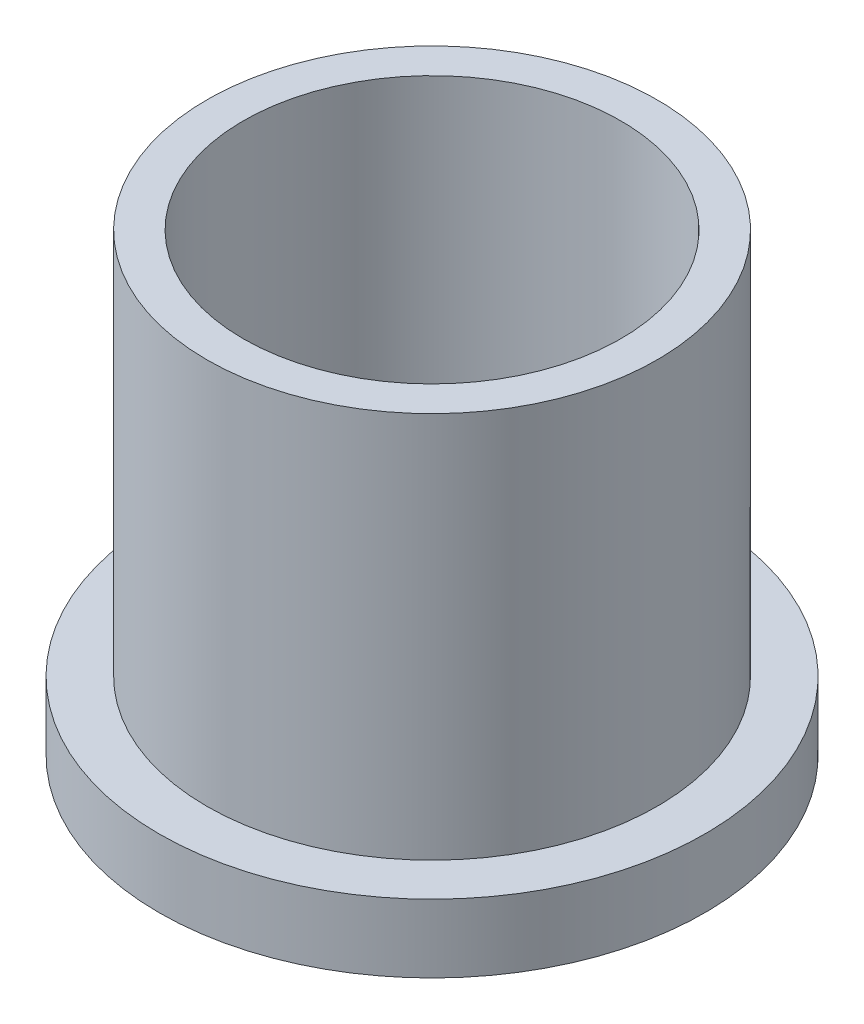
ISO-10303-21;
HEADER;
FILE_DESCRIPTION(('STEP AP214'),'2;1');
FILE_NAME('part.step','',(''),(''),'','','');
FILE_SCHEMA(('AUTOMOTIVE_DESIGN { 1 0 10303 214 1 1 1 1 }'));
ENDSEC;
DATA;
#1=APPLICATION_CONTEXT('core data for automotive mechanical design processes');
#2=APPLICATION_PROTOCOL_DEFINITION('international standard','automotive_design',2000,#1);
#3=PRODUCT_CONTEXT('',#1,'mechanical');
#4=PRODUCT('Part','Part','',(#3));
#5=PRODUCT_RELATED_PRODUCT_CATEGORY('part','',(#4));
#6=PRODUCT_DEFINITION_FORMATION('','',#4);
#7=PRODUCT_DEFINITION_CONTEXT('part definition',#1,'design');
#8=PRODUCT_DEFINITION('design','',#6,#7);
#9=PRODUCT_DEFINITION_SHAPE('','',#8);
#10=(LENGTH_UNIT() NAMED_UNIT(*) SI_UNIT(.MILLI.,.METRE.));
#11=(NAMED_UNIT(*) PLANE_ANGLE_UNIT() SI_UNIT($,.RADIAN.));
#12=(NAMED_UNIT(*) SI_UNIT($,.STERADIAN.) SOLID_ANGLE_UNIT());
#13=UNCERTAINTY_MEASURE_WITH_UNIT(LENGTH_MEASURE(1.E-05),#10,'distance_accuracy_value','');
#14=(GEOMETRIC_REPRESENTATION_CONTEXT(3) GLOBAL_UNCERTAINTY_ASSIGNED_CONTEXT((#13)) GLOBAL_UNIT_ASSIGNED_CONTEXT((#10,
#11,#12)) REPRESENTATION_CONTEXT('',''));
#15=CARTESIAN_POINT('',(0.,0.,0.));
#16=DIRECTION('',(0.,0.,1.));
#17=DIRECTION('',(1.,0.,0.));
#18=AXIS2_PLACEMENT_3D('',#15,#16,#17);
#19=CARTESIAN_POINT('',(0.,10.,0.));
#20=DIRECTION('',(0.,-1.,0.));
#21=DIRECTION('',(0.,0.,-1.));
#22=AXIS2_PLACEMENT_3D('',#19,#20,#21);
#23=CYLINDRICAL_SURFACE('',#22,4.15);
#24=CARTESIAN_POINT('',(0.,10.,0.));
#25=DIRECTION('',(0.,1.,0.));
#26=DIRECTION('',(0.,0.,1.));
#27=AXIS2_PLACEMENT_3D('',#24,#25,#26);
#28=CIRCLE('',#27,4.15);
#29=CARTESIAN_POINT('',(0.,10.,4.15));
#30=VERTEX_POINT('',#29);
#31=EDGE_CURVE('E40',#30,#30,#28,.T.);
#32=ORIENTED_EDGE('',*,*,#31,.T.);
#33=EDGE_LOOP('',(#32));
#34=FACE_BOUND('',#33,.T.);
#35=CARTESIAN_POINT('',(0.,0.,0.));
#36=DIRECTION('',(0.,1.,0.));
#37=DIRECTION('',(0.,0.,1.));
#38=AXIS2_PLACEMENT_3D('',#35,#36,#37);
#39=CIRCLE('',#38,4.15);
#40=CARTESIAN_POINT('',(0.,0.,4.15));
#41=VERTEX_POINT('',#40);
#42=EDGE_CURVE('E36',#41,#41,#39,.T.);
#43=ORIENTED_EDGE('',*,*,#42,.F.);
#44=EDGE_LOOP('',(#43));
#45=FACE_BOUND('',#44,.T.);
#46=ADVANCED_FACE('F33',(#34,#45),#23,.F.);
#47=CARTESIAN_POINT('',(0.,10.,0.));
#48=DIRECTION('',(0.,-1.,0.));
#49=DIRECTION('',(0.,0.,-1.));
#50=AXIS2_PLACEMENT_3D('',#47,#48,#49);
#51=CYLINDRICAL_SURFACE('',#50,4.95);
#52=CARTESIAN_POINT('',(0.,1.5,0.));
#53=DIRECTION('',(0.,1.,0.));
#54=DIRECTION('',(0.,0.,1.));
#55=AXIS2_PLACEMENT_3D('',#52,#53,#54);
#56=CIRCLE('',#55,4.95);
#57=CARTESIAN_POINT('',(0.,1.5,4.95));
#58=VERTEX_POINT('',#57);
#59=EDGE_CURVE('E49',#58,#58,#56,.T.);
#60=ORIENTED_EDGE('',*,*,#59,.T.);
#61=EDGE_LOOP('',(#60));
#62=FACE_BOUND('',#61,.T.);
#63=CARTESIAN_POINT('',(0.,10.,0.));
#64=DIRECTION('',(0.,1.,0.));
#65=DIRECTION('',(0.,0.,1.));
#66=AXIS2_PLACEMENT_3D('',#63,#64,#65);
#67=CIRCLE('',#66,4.95);
#68=CARTESIAN_POINT('',(0.,10.,4.95));
#69=VERTEX_POINT('',#68);
#70=EDGE_CURVE('E10',#69,#69,#67,.T.);
#71=ORIENTED_EDGE('',*,*,#70,.F.);
#72=EDGE_LOOP('',(#71));
#73=FACE_BOUND('',#72,.T.);
#74=ADVANCED_FACE('F56',(#62,#73),#51,.T.);
#75=CARTESIAN_POINT('',(0.,10.,0.));
#76=DIRECTION('',(0.,1.,0.));
#77=DIRECTION('',(0.,0.,1.));
#78=AXIS2_PLACEMENT_3D('',#75,#76,#77);
#79=PLANE('',#78);
#80=ORIENTED_EDGE('',*,*,#31,.F.);
#81=EDGE_LOOP('',(#80));
#82=FACE_BOUND('',#81,.T.);
#83=ORIENTED_EDGE('',*,*,#70,.T.);
#84=EDGE_LOOP('',(#83));
#85=FACE_BOUND('',#84,.T.);
#86=ADVANCED_FACE('F73',(#82,#85),#79,.T.);
#87=CARTESIAN_POINT('',(0.,0.,0.));
#88=DIRECTION('',(0.,1.,0.));
#89=DIRECTION('',(0.,0.,1.));
#90=AXIS2_PLACEMENT_3D('',#87,#88,#89);
#91=PLANE('',#90);
#92=ORIENTED_EDGE('',*,*,#42,.T.);
#93=EDGE_LOOP('',(#92));
#94=FACE_BOUND('',#93,.T.);
#95=CARTESIAN_POINT('',(0.,0.,0.));
#96=DIRECTION('',(0.,1.,0.));
#97=DIRECTION('',(0.,0.,1.));
#98=AXIS2_PLACEMENT_3D('',#95,#96,#97);
#99=CIRCLE('',#98,6.);
#100=CARTESIAN_POINT('',(0.,0.,6.));
#101=VERTEX_POINT('',#100);
#102=EDGE_CURVE('E46',#101,#101,#99,.T.);
#103=ORIENTED_EDGE('',*,*,#102,.F.);
#104=EDGE_LOOP('',(#103));
#105=FACE_BOUND('',#104,.T.);
#106=ADVANCED_FACE('F68',(#94,#105),#91,.F.);
#107=CARTESIAN_POINT('',(0.,1.5,0.));
#108=DIRECTION('',(0.,-1.,0.));
#109=DIRECTION('',(0.,0.,-1.));
#110=AXIS2_PLACEMENT_3D('',#107,#108,#109);
#111=CYLINDRICAL_SURFACE('',#110,6.);
#112=CARTESIAN_POINT('',(0.,1.5,0.));
#113=DIRECTION('',(0.,1.,0.));
#114=DIRECTION('',(0.,0.,1.));
#115=AXIS2_PLACEMENT_3D('',#112,#113,#114);
#116=CIRCLE('',#115,6.);
#117=CARTESIAN_POINT('',(0.,1.5,6.));
#118=VERTEX_POINT('',#117);
#119=EDGE_CURVE('E50',#118,#118,#116,.T.);
#120=ORIENTED_EDGE('',*,*,#119,.F.);
#121=EDGE_LOOP('',(#120));
#122=FACE_BOUND('',#121,.T.);
#123=ORIENTED_EDGE('',*,*,#102,.T.);
#124=EDGE_LOOP('',(#123));
#125=FACE_BOUND('',#124,.T.);
#126=ADVANCED_FACE('F62',(#122,#125),#111,.T.);
#127=CARTESIAN_POINT('',(0.,1.5,0.));
#128=DIRECTION('',(0.,1.,0.));
#129=DIRECTION('',(0.,0.,1.));
#130=AXIS2_PLACEMENT_3D('',#127,#128,#129);
#131=PLANE('',#130);
#132=ORIENTED_EDGE('',*,*,#59,.F.);
#133=EDGE_LOOP('',(#132));
#134=FACE_BOUND('',#133,.T.);
#135=ORIENTED_EDGE('',*,*,#119,.T.);
#136=EDGE_LOOP('',(#135));
#137=FACE_BOUND('',#136,.T.);
#138=ADVANCED_FACE('F59',(#134,#137),#131,.T.);
#139=CLOSED_SHELL('',(#46,#74,#86,#106,#126,#138));
#140=MANIFOLD_SOLID_BREP('B2',#139);
#141=ADVANCED_BREP_SHAPE_REPRESENTATION('',(#18,#140),#14);
#142=SHAPE_DEFINITION_REPRESENTATION(#9,#141);
ENDSEC;
END-ISO-10303-21;
